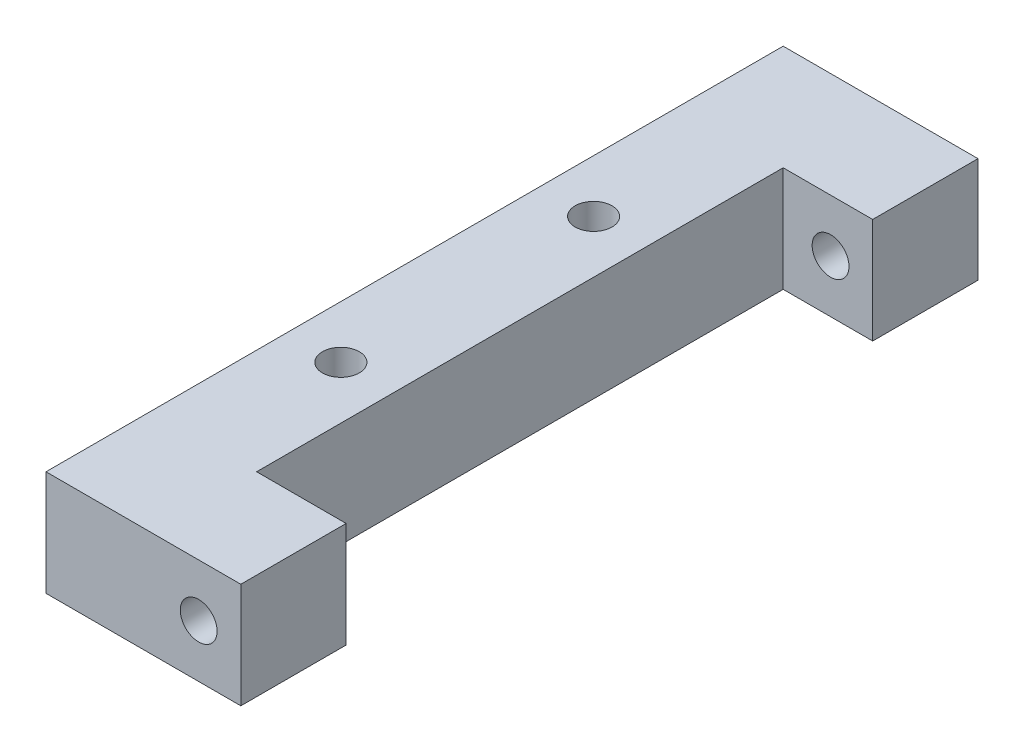
ISO-10303-21;
HEADER;
FILE_DESCRIPTION(('STEP AP214'),'2;1');
FILE_NAME('part.step','',(''),(''),'','','');
FILE_SCHEMA(('AUTOMOTIVE_DESIGN { 1 0 10303 214 1 1 1 1 }'));
ENDSEC;
DATA;
#1=APPLICATION_CONTEXT('core data for automotive mechanical design processes');
#2=APPLICATION_PROTOCOL_DEFINITION('international standard','automotive_design',2000,#1);
#3=PRODUCT_CONTEXT('',#1,'mechanical');
#4=PRODUCT('Part','Part','',(#3));
#5=PRODUCT_RELATED_PRODUCT_CATEGORY('part','',(#4));
#6=PRODUCT_DEFINITION_FORMATION('','',#4);
#7=PRODUCT_DEFINITION_CONTEXT('part definition',#1,'design');
#8=PRODUCT_DEFINITION('design','',#6,#7);
#9=PRODUCT_DEFINITION_SHAPE('','',#8);
#10=(LENGTH_UNIT() NAMED_UNIT(*) SI_UNIT(.MILLI.,.METRE.));
#11=(NAMED_UNIT(*) PLANE_ANGLE_UNIT() SI_UNIT($,.RADIAN.));
#12=(NAMED_UNIT(*) SI_UNIT($,.STERADIAN.) SOLID_ANGLE_UNIT());
#13=UNCERTAINTY_MEASURE_WITH_UNIT(LENGTH_MEASURE(1.E-05),#10,'distance_accuracy_value','');
#14=(GEOMETRIC_REPRESENTATION_CONTEXT(3) GLOBAL_UNCERTAINTY_ASSIGNED_CONTEXT((#13)) GLOBAL_UNIT_ASSIGNED_CONTEXT((#10,
#11,#12)) REPRESENTATION_CONTEXT('',''));
#15=CARTESIAN_POINT('',(0.,0.,0.));
#16=DIRECTION('',(0.,0.,1.));
#17=DIRECTION('',(1.,0.,0.));
#18=AXIS2_PLACEMENT_3D('',#15,#16,#17);
#19=CARTESIAN_POINT('',(9.25,5.,10.));
#20=DIRECTION('',(-1.,0.,0.));
#21=DIRECTION('',(0.,0.,1.));
#22=AXIS2_PLACEMENT_3D('',#19,#20,#21);
#23=PLANE('',#22);
#24=DIRECTION('',(0.,1.,0.));
#25=VECTOR('',#24,1.);
#26=CARTESIAN_POINT('',(9.25,5.,0.));
#27=LINE('',#26,#25);
#28=CARTESIAN_POINT('',(9.25,-5.,0.));
#29=VERTEX_POINT('',#28);
#30=CARTESIAN_POINT('',(9.25,5.,0.));
#31=VERTEX_POINT('',#30);
#32=EDGE_CURVE('E91',#29,#31,#27,.T.);
#33=ORIENTED_EDGE('',*,*,#32,.T.);
#34=DIRECTION('',(0.,0.,-1.));
#35=VECTOR('',#34,1.);
#36=CARTESIAN_POINT('',(9.25,5.,10.));
#37=LINE('',#36,#35);
#38=CARTESIAN_POINT('',(9.25,5.,10.));
#39=VERTEX_POINT('',#38);
#40=EDGE_CURVE('E11',#39,#31,#37,.T.);
#41=ORIENTED_EDGE('',*,*,#40,.F.);
#42=DIRECTION('',(0.,1.,0.));
#43=VECTOR('',#42,1.);
#44=CARTESIAN_POINT('',(9.25,5.,10.));
#45=LINE('',#44,#43);
#46=CARTESIAN_POINT('',(9.25,-5.,10.));
#47=VERTEX_POINT('',#46);
#48=EDGE_CURVE('E85',#47,#39,#45,.T.);
#49=ORIENTED_EDGE('',*,*,#48,.F.);
#50=DIRECTION('',(0.,0.,-1.));
#51=VECTOR('',#50,1.);
#52=CARTESIAN_POINT('',(9.25,-5.,10.));
#53=LINE('',#52,#51);
#54=EDGE_CURVE('E77',#47,#29,#53,.T.);
#55=ORIENTED_EDGE('',*,*,#54,.T.);
#56=EDGE_LOOP('',(#33,#41,#49,#55));
#57=FACE_BOUND('',#56,.T.);
#58=ADVANCED_FACE('F33',(#57),#23,.F.);
#59=CARTESIAN_POINT('',(-9.25,5.,10.));
#60=DIRECTION('',(0.,-1.,0.));
#61=DIRECTION('',(0.,0.,-1.));
#62=AXIS2_PLACEMENT_3D('',#59,#60,#61);
#63=PLANE('',#62);
#64=CARTESIAN_POINT('',(-4.25,5.,47.));
#65=DIRECTION('',(0.,1.,0.));
#66=DIRECTION('',(0.,0.,1.));
#67=AXIS2_PLACEMENT_3D('',#64,#65,#66);
#68=CIRCLE('',#67,1.75);
#69=CARTESIAN_POINT('',(-4.25,5.,48.75));
#70=VERTEX_POINT('',#69);
#71=EDGE_CURVE('E143',#70,#70,#68,.T.);
#72=ORIENTED_EDGE('',*,*,#71,.F.);
#73=EDGE_LOOP('',(#72));
#74=FACE_BOUND('',#73,.T.);
#75=CARTESIAN_POINT('',(-4.25,5.,23.));
#76=DIRECTION('',(0.,1.,0.));
#77=DIRECTION('',(0.,0.,1.));
#78=AXIS2_PLACEMENT_3D('',#75,#76,#77);
#79=CIRCLE('',#78,1.75);
#80=CARTESIAN_POINT('',(-4.25,5.,24.75));
#81=VERTEX_POINT('',#80);
#82=EDGE_CURVE('E132',#81,#81,#79,.T.);
#83=ORIENTED_EDGE('',*,*,#82,.F.);
#84=EDGE_LOOP('',(#83));
#85=FACE_BOUND('',#84,.T.);
#86=DIRECTION('',(-1.,0.,0.));
#87=VECTOR('',#86,1.);
#88=CARTESIAN_POINT('',(-9.25,5.,0.));
#89=LINE('',#88,#87);
#90=CARTESIAN_POINT('',(-9.25,5.,0.));
#91=VERTEX_POINT('',#90);
#92=EDGE_CURVE('E94',#31,#91,#89,.T.);
#93=ORIENTED_EDGE('',*,*,#92,.T.);
#94=DIRECTION('',(0.,0.,-1.));
#95=VECTOR('',#94,1.);
#96=CARTESIAN_POINT('',(-9.25,5.,10.));
#97=LINE('',#96,#95);
#98=CARTESIAN_POINT('',(-9.25,5.,70.));
#99=VERTEX_POINT('',#98);
#100=EDGE_CURVE('E41',#99,#91,#97,.T.);
#101=ORIENTED_EDGE('',*,*,#100,.F.);
#102=DIRECTION('',(-1.,0.,0.));
#103=VECTOR('',#102,1.);
#104=CARTESIAN_POINT('',(-9.25,5.,70.));
#105=LINE('',#104,#103);
#106=CARTESIAN_POINT('',(9.25,5.,70.));
#107=VERTEX_POINT('',#106);
#108=EDGE_CURVE('E165',#107,#99,#105,.T.);
#109=ORIENTED_EDGE('',*,*,#108,.F.);
#110=DIRECTION('',(0.,0.,-1.));
#111=VECTOR('',#110,1.);
#112=CARTESIAN_POINT('',(9.25,5.,70.));
#113=LINE('',#112,#111);
#114=CARTESIAN_POINT('',(9.25,5.,60.));
#115=VERTEX_POINT('',#114);
#116=EDGE_CURVE('E168',#107,#115,#113,.T.);
#117=ORIENTED_EDGE('',*,*,#116,.T.);
#118=DIRECTION('',(-1.,0.,0.));
#119=VECTOR('',#118,1.);
#120=CARTESIAN_POINT('',(-9.25,5.,60.));
#121=LINE('',#120,#119);
#122=CARTESIAN_POINT('',(0.750000000000004,5.,60.));
#123=VERTEX_POINT('',#122);
#124=EDGE_CURVE('E159',#115,#123,#121,.T.);
#125=ORIENTED_EDGE('',*,*,#124,.T.);
#126=DIRECTION('',(0.,0.,-1.));
#127=VECTOR('',#126,1.);
#128=CARTESIAN_POINT('',(0.750000000000002,5.,60.));
#129=LINE('',#128,#127);
#130=CARTESIAN_POINT('',(0.750000000000002,5.,10.));
#131=VERTEX_POINT('',#130);
#132=EDGE_CURVE('E99',#123,#131,#129,.T.);
#133=ORIENTED_EDGE('',*,*,#132,.T.);
#134=DIRECTION('',(-1.,0.,0.));
#135=VECTOR('',#134,1.);
#136=CARTESIAN_POINT('',(-9.25,5.,10.));
#137=LINE('',#136,#135);
#138=EDGE_CURVE('E109',#39,#131,#137,.T.);
#139=ORIENTED_EDGE('',*,*,#138,.F.);
#140=ORIENTED_EDGE('',*,*,#40,.T.);
#141=EDGE_LOOP('',(#93,#101,#109,#117,#125,#133,#139,#140));
#142=FACE_BOUND('',#141,.T.);
#143=ADVANCED_FACE('F202',(#74,#85,#142),#63,.F.);
#144=CARTESIAN_POINT('',(-9.25,5.,10.));
#145=DIRECTION('',(1.,0.,0.));
#146=DIRECTION('',(0.,0.,-1.));
#147=AXIS2_PLACEMENT_3D('',#144,#145,#146);
#148=PLANE('',#147);
#149=DIRECTION('',(0.,-1.,0.));
#150=VECTOR('',#149,1.);
#151=CARTESIAN_POINT('',(-9.25,5.,0.));
#152=LINE('',#151,#150);
#153=CARTESIAN_POINT('',(-9.25,-5.,0.));
#154=VERTEX_POINT('',#153);
#155=EDGE_CURVE('E86',#91,#154,#152,.T.);
#156=ORIENTED_EDGE('',*,*,#155,.T.);
#157=DIRECTION('',(0.,0.,-1.));
#158=VECTOR('',#157,1.);
#159=CARTESIAN_POINT('',(-9.25,-5.,10.));
#160=LINE('',#159,#158);
#161=CARTESIAN_POINT('',(-9.25,-5.,70.));
#162=VERTEX_POINT('',#161);
#163=EDGE_CURVE('E81',#162,#154,#160,.T.);
#164=ORIENTED_EDGE('',*,*,#163,.F.);
#165=DIRECTION('',(0.,-1.,0.));
#166=VECTOR('',#165,1.);
#167=CARTESIAN_POINT('',(-9.25,5.,70.));
#168=LINE('',#167,#166);
#169=EDGE_CURVE('E155',#99,#162,#168,.T.);
#170=ORIENTED_EDGE('',*,*,#169,.F.);
#171=ORIENTED_EDGE('',*,*,#100,.T.);
#172=EDGE_LOOP('',(#156,#164,#170,#171));
#173=FACE_BOUND('',#172,.T.);
#174=ADVANCED_FACE('F231',(#173),#148,.F.);
#175=CARTESIAN_POINT('',(-9.25,-5.,10.));
#176=DIRECTION('',(0.,1.,0.));
#177=DIRECTION('',(0.,0.,1.));
#178=AXIS2_PLACEMENT_3D('',#175,#176,#177);
#179=PLANE('',#178);
#180=CARTESIAN_POINT('',(-4.25,-5.,47.));
#181=DIRECTION('',(0.,1.,0.));
#182=DIRECTION('',(0.,0.,1.));
#183=AXIS2_PLACEMENT_3D('',#180,#181,#182);
#184=CIRCLE('',#183,1.75);
#185=CARTESIAN_POINT('',(-4.25,-5.,48.75));
#186=VERTEX_POINT('',#185);
#187=EDGE_CURVE('E36',#186,#186,#184,.T.);
#188=ORIENTED_EDGE('',*,*,#187,.T.);
#189=EDGE_LOOP('',(#188));
#190=FACE_BOUND('',#189,.T.);
#191=CARTESIAN_POINT('',(-4.25,-5.,23.));
#192=DIRECTION('',(0.,1.,0.));
#193=DIRECTION('',(0.,0.,1.));
#194=AXIS2_PLACEMENT_3D('',#191,#192,#193);
#195=CIRCLE('',#194,1.75);
#196=CARTESIAN_POINT('',(-4.25,-5.,24.75));
#197=VERTEX_POINT('',#196);
#198=EDGE_CURVE('E129',#197,#197,#195,.T.);
#199=ORIENTED_EDGE('',*,*,#198,.T.);
#200=EDGE_LOOP('',(#199));
#201=FACE_BOUND('',#200,.T.);
#202=DIRECTION('',(1.,0.,0.));
#203=VECTOR('',#202,1.);
#204=CARTESIAN_POINT('',(-9.25,-5.,0.));
#205=LINE('',#204,#203);
#206=EDGE_CURVE('E74',#154,#29,#205,.T.);
#207=ORIENTED_EDGE('',*,*,#206,.T.);
#208=ORIENTED_EDGE('',*,*,#54,.F.);
#209=DIRECTION('',(1.,0.,0.));
#210=VECTOR('',#209,1.);
#211=CARTESIAN_POINT('',(-9.25,-5.,10.));
#212=LINE('',#211,#210);
#213=CARTESIAN_POINT('',(0.750000000000004,-5.,10.));
#214=VERTEX_POINT('',#213);
#215=EDGE_CURVE('E54',#214,#47,#212,.T.);
#216=ORIENTED_EDGE('',*,*,#215,.F.);
#217=DIRECTION('',(0.,0.,-1.));
#218=VECTOR('',#217,1.);
#219=CARTESIAN_POINT('',(0.750000000000004,-5.,60.));
#220=LINE('',#219,#218);
#221=CARTESIAN_POINT('',(0.750000000000004,-5.,60.));
#222=VERTEX_POINT('',#221);
#223=EDGE_CURVE('E95',#222,#214,#220,.T.);
#224=ORIENTED_EDGE('',*,*,#223,.F.);
#225=DIRECTION('',(1.,0.,0.));
#226=VECTOR('',#225,1.);
#227=CARTESIAN_POINT('',(-9.25,-5.,60.));
#228=LINE('',#227,#226);
#229=CARTESIAN_POINT('',(9.25,-5.,60.));
#230=VERTEX_POINT('',#229);
#231=EDGE_CURVE('E154',#222,#230,#228,.T.);
#232=ORIENTED_EDGE('',*,*,#231,.T.);
#233=DIRECTION('',(0.,0.,-1.));
#234=VECTOR('',#233,1.);
#235=CARTESIAN_POINT('',(9.25,-5.,70.));
#236=LINE('',#235,#234);
#237=CARTESIAN_POINT('',(9.25,-5.,70.));
#238=VERTEX_POINT('',#237);
#239=EDGE_CURVE('E121',#238,#230,#236,.T.);
#240=ORIENTED_EDGE('',*,*,#239,.F.);
#241=DIRECTION('',(1.,0.,0.));
#242=VECTOR('',#241,1.);
#243=CARTESIAN_POINT('',(-9.25,-5.,70.));
#244=LINE('',#243,#242);
#245=EDGE_CURVE('E158',#162,#238,#244,.T.);
#246=ORIENTED_EDGE('',*,*,#245,.F.);
#247=ORIENTED_EDGE('',*,*,#163,.T.);
#248=EDGE_LOOP('',(#207,#208,#216,#224,#232,#240,#246,#247));
#249=FACE_BOUND('',#248,.T.);
#250=ADVANCED_FACE('F76',(#190,#201,#249),#179,.F.);
#251=CARTESIAN_POINT('',(0.,0.,10.));
#252=DIRECTION('',(0.,0.,1.));
#253=DIRECTION('',(1.,0.,0.));
#254=AXIS2_PLACEMENT_3D('',#251,#252,#253);
#255=PLANE('',#254);
#256=CARTESIAN_POINT('',(5.25,0.,10.));
#257=DIRECTION('',(0.,0.,1.));
#258=DIRECTION('',(1.,0.,0.));
#259=AXIS2_PLACEMENT_3D('',#256,#257,#258);
#260=CIRCLE('',#259,1.75);
#261=CARTESIAN_POINT('',(7.,0.,10.));
#262=VERTEX_POINT('',#261);
#263=EDGE_CURVE('E151',#262,#262,#260,.T.);
#264=ORIENTED_EDGE('',*,*,#263,.F.);
#265=EDGE_LOOP('',(#264));
#266=FACE_BOUND('',#265,.T.);
#267=DIRECTION('',(0.,1.,0.));
#268=VECTOR('',#267,1.);
#269=CARTESIAN_POINT('',(0.750000000000002,5.,10.));
#270=LINE('',#269,#268);
#271=EDGE_CURVE('E49',#214,#131,#270,.T.);
#272=ORIENTED_EDGE('',*,*,#271,.F.);
#273=ORIENTED_EDGE('',*,*,#215,.T.);
#274=ORIENTED_EDGE('',*,*,#48,.T.);
#275=ORIENTED_EDGE('',*,*,#138,.T.);
#276=EDGE_LOOP('',(#272,#273,#274,#275));
#277=FACE_BOUND('',#276,.T.);
#278=ADVANCED_FACE('F222',(#266,#277),#255,.T.);
#279=CARTESIAN_POINT('',(0.,0.,0.));
#280=DIRECTION('',(0.,0.,1.));
#281=DIRECTION('',(1.,0.,0.));
#282=AXIS2_PLACEMENT_3D('',#279,#280,#281);
#283=PLANE('',#282);
#284=CARTESIAN_POINT('',(5.25,0.,0.));
#285=DIRECTION('',(0.,0.,1.));
#286=DIRECTION('',(1.,0.,0.));
#287=AXIS2_PLACEMENT_3D('',#284,#285,#286);
#288=CIRCLE('',#287,1.75);
#289=CARTESIAN_POINT('',(7.,0.,0.));
#290=VERTEX_POINT('',#289);
#291=EDGE_CURVE('E136',#290,#290,#288,.T.);
#292=ORIENTED_EDGE('',*,*,#291,.T.);
#293=EDGE_LOOP('',(#292));
#294=FACE_BOUND('',#293,.T.);
#295=ORIENTED_EDGE('',*,*,#32,.F.);
#296=ORIENTED_EDGE('',*,*,#206,.F.);
#297=ORIENTED_EDGE('',*,*,#155,.F.);
#298=ORIENTED_EDGE('',*,*,#92,.F.);
#299=EDGE_LOOP('',(#295,#296,#297,#298));
#300=FACE_BOUND('',#299,.T.);
#301=ADVANCED_FACE('F93',(#294,#300),#283,.F.);
#302=CARTESIAN_POINT('',(0.750000000000002,5.,60.));
#303=DIRECTION('',(-1.,0.,0.));
#304=DIRECTION('',(0.,-1.,0.));
#305=AXIS2_PLACEMENT_3D('',#302,#303,#304);
#306=PLANE('',#305);
#307=ORIENTED_EDGE('',*,*,#271,.T.);
#308=ORIENTED_EDGE('',*,*,#132,.F.);
#309=DIRECTION('',(0.,1.,0.));
#310=VECTOR('',#309,1.);
#311=CARTESIAN_POINT('',(0.750000000000002,5.,60.));
#312=LINE('',#311,#310);
#313=EDGE_CURVE('E120',#222,#123,#312,.T.);
#314=ORIENTED_EDGE('',*,*,#313,.F.);
#315=ORIENTED_EDGE('',*,*,#223,.T.);
#316=EDGE_LOOP('',(#307,#308,#314,#315));
#317=FACE_BOUND('',#316,.T.);
#318=ADVANCED_FACE('F213',(#317),#306,.F.);
#319=CARTESIAN_POINT('',(0.,0.,60.));
#320=DIRECTION('',(0.,0.,1.));
#321=DIRECTION('',(1.,0.,0.));
#322=AXIS2_PLACEMENT_3D('',#319,#320,#321);
#323=PLANE('',#322);
#324=CARTESIAN_POINT('',(5.25,0.,60.));
#325=DIRECTION('',(0.,0.,1.));
#326=DIRECTION('',(1.,0.,0.));
#327=AXIS2_PLACEMENT_3D('',#324,#325,#326);
#328=CIRCLE('',#327,1.75);
#329=CARTESIAN_POINT('',(7.,0.,60.));
#330=VERTEX_POINT('',#329);
#331=EDGE_CURVE('E147',#330,#330,#328,.T.);
#332=ORIENTED_EDGE('',*,*,#331,.T.);
#333=EDGE_LOOP('',(#332));
#334=FACE_BOUND('',#333,.T.);
#335=ORIENTED_EDGE('',*,*,#231,.F.);
#336=ORIENTED_EDGE('',*,*,#313,.T.);
#337=ORIENTED_EDGE('',*,*,#124,.F.);
#338=DIRECTION('',(0.,1.,0.));
#339=VECTOR('',#338,1.);
#340=CARTESIAN_POINT('',(9.25,5.,60.));
#341=LINE('',#340,#339);
#342=EDGE_CURVE('E171',#230,#115,#341,.T.);
#343=ORIENTED_EDGE('',*,*,#342,.F.);
#344=EDGE_LOOP('',(#335,#336,#337,#343));
#345=FACE_BOUND('',#344,.T.);
#346=ADVANCED_FACE('F197',(#334,#345),#323,.F.);
#347=CARTESIAN_POINT('',(9.25,5.,70.));
#348=DIRECTION('',(-1.,0.,0.));
#349=DIRECTION('',(0.,0.,1.));
#350=AXIS2_PLACEMENT_3D('',#347,#348,#349);
#351=PLANE('',#350);
#352=ORIENTED_EDGE('',*,*,#342,.T.);
#353=ORIENTED_EDGE('',*,*,#116,.F.);
#354=DIRECTION('',(0.,1.,0.));
#355=VECTOR('',#354,1.);
#356=CARTESIAN_POINT('',(9.25,5.,70.));
#357=LINE('',#356,#355);
#358=EDGE_CURVE('E162',#238,#107,#357,.T.);
#359=ORIENTED_EDGE('',*,*,#358,.F.);
#360=ORIENTED_EDGE('',*,*,#239,.T.);
#361=EDGE_LOOP('',(#352,#353,#359,#360));
#362=FACE_BOUND('',#361,.T.);
#363=ADVANCED_FACE('F192',(#362),#351,.F.);
#364=CARTESIAN_POINT('',(0.,0.,70.));
#365=DIRECTION('',(0.,0.,1.));
#366=DIRECTION('',(1.,0.,0.));
#367=AXIS2_PLACEMENT_3D('',#364,#365,#366);
#368=PLANE('',#367);
#369=CARTESIAN_POINT('',(5.25,0.,70.));
#370=DIRECTION('',(0.,0.,1.));
#371=DIRECTION('',(1.,0.,0.));
#372=AXIS2_PLACEMENT_3D('',#369,#370,#371);
#373=CIRCLE('',#372,1.75);
#374=CARTESIAN_POINT('',(7.,0.,70.));
#375=VERTEX_POINT('',#374);
#376=EDGE_CURVE('E131',#375,#375,#373,.T.);
#377=ORIENTED_EDGE('',*,*,#376,.F.);
#378=EDGE_LOOP('',(#377));
#379=FACE_BOUND('',#378,.T.);
#380=ORIENTED_EDGE('',*,*,#169,.T.);
#381=ORIENTED_EDGE('',*,*,#245,.T.);
#382=ORIENTED_EDGE('',*,*,#358,.T.);
#383=ORIENTED_EDGE('',*,*,#108,.T.);
#384=EDGE_LOOP('',(#380,#381,#382,#383));
#385=FACE_BOUND('',#384,.T.);
#386=ADVANCED_FACE('F262',(#379,#385),#368,.T.);
#387=CARTESIAN_POINT('',(5.25,0.,0.));
#388=DIRECTION('',(0.,0.,1.));
#389=DIRECTION('',(1.,0.,0.));
#390=AXIS2_PLACEMENT_3D('',#387,#388,#389);
#391=CYLINDRICAL_SURFACE('',#390,1.75);
#392=ORIENTED_EDGE('',*,*,#376,.T.);
#393=EDGE_LOOP('',(#392));
#394=FACE_BOUND('',#393,.T.);
#395=ORIENTED_EDGE('',*,*,#331,.F.);
#396=EDGE_LOOP('',(#395));
#397=FACE_BOUND('',#396,.T.);
#398=ADVANCED_FACE('F253',(#394,#397),#391,.F.);
#399=ORIENTED_EDGE('',*,*,#263,.T.);
#400=EDGE_LOOP('',(#399));
#401=FACE_BOUND('',#400,.T.);
#402=ORIENTED_EDGE('',*,*,#291,.F.);
#403=EDGE_LOOP('',(#402));
#404=FACE_BOUND('',#403,.T.);
#405=ADVANCED_FACE('F249',(#401,#404),#391,.F.);
#406=CARTESIAN_POINT('',(-4.25,-5.00005,23.));
#407=DIRECTION('',(0.,1.,0.));
#408=DIRECTION('',(0.,0.,1.));
#409=AXIS2_PLACEMENT_3D('',#406,#407,#408);
#410=CYLINDRICAL_SURFACE('',#409,1.75);
#411=ORIENTED_EDGE('',*,*,#82,.T.);
#412=EDGE_LOOP('',(#411));
#413=FACE_BOUND('',#412,.T.);
#414=ORIENTED_EDGE('',*,*,#198,.F.);
#415=EDGE_LOOP('',(#414));
#416=FACE_BOUND('',#415,.T.);
#417=ADVANCED_FACE('F252',(#413,#416),#410,.F.);
#418=CARTESIAN_POINT('',(-4.25,-5.00005,47.));
#419=DIRECTION('',(0.,1.,0.));
#420=DIRECTION('',(0.,0.,1.));
#421=AXIS2_PLACEMENT_3D('',#418,#419,#420);
#422=CYLINDRICAL_SURFACE('',#421,1.75);
#423=ORIENTED_EDGE('',*,*,#71,.T.);
#424=EDGE_LOOP('',(#423));
#425=FACE_BOUND('',#424,.T.);
#426=ORIENTED_EDGE('',*,*,#187,.F.);
#427=EDGE_LOOP('',(#426));
#428=FACE_BOUND('',#427,.T.);
#429=ADVANCED_FACE('F260',(#425,#428),#422,.F.);
#430=CLOSED_SHELL('',(#58,#143,#174,#250,#278,#301,#318,#346,#363,#386,#398,#405,#417,#429));
#431=MANIFOLD_SOLID_BREP('B2',#430);
#432=ADVANCED_BREP_SHAPE_REPRESENTATION('',(#18,#431),#14);
#433=SHAPE_DEFINITION_REPRESENTATION(#9,#432);
ENDSEC;
END-ISO-10303-21;
